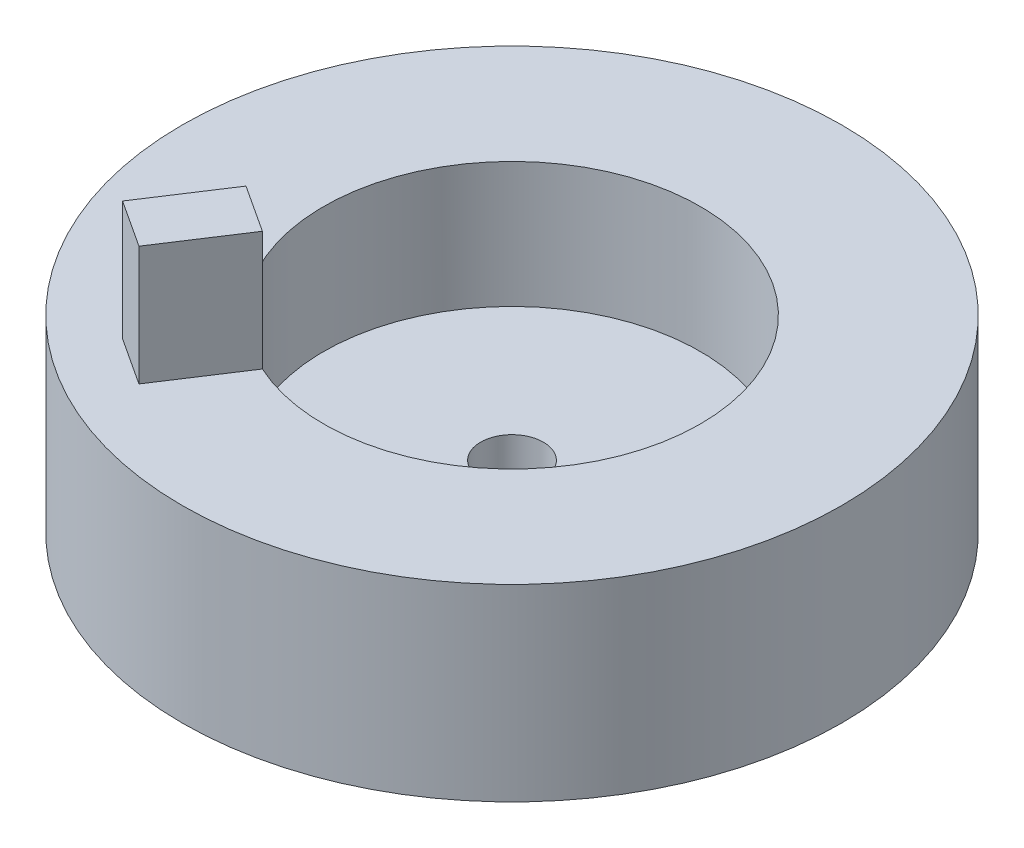
ISO-10303-21;
HEADER;
FILE_DESCRIPTION(('STEP AP214'),'2;1');
FILE_NAME('part.step','',(''),(''),'','','');
FILE_SCHEMA(('AUTOMOTIVE_DESIGN { 1 0 10303 214 1 1 1 1 }'));
ENDSEC;
DATA;
#1=APPLICATION_CONTEXT('core data for automotive mechanical design processes');
#2=APPLICATION_PROTOCOL_DEFINITION('international standard','automotive_design',2000,#1);
#3=PRODUCT_CONTEXT('',#1,'mechanical');
#4=PRODUCT('Part','Part','',(#3));
#5=PRODUCT_RELATED_PRODUCT_CATEGORY('part','',(#4));
#6=PRODUCT_DEFINITION_FORMATION('','',#4);
#7=PRODUCT_DEFINITION_CONTEXT('part definition',#1,'design');
#8=PRODUCT_DEFINITION('design','',#6,#7);
#9=PRODUCT_DEFINITION_SHAPE('','',#8);
#10=(LENGTH_UNIT() NAMED_UNIT(*) SI_UNIT(.MILLI.,.METRE.));
#11=(NAMED_UNIT(*) PLANE_ANGLE_UNIT() SI_UNIT($,.RADIAN.));
#12=(NAMED_UNIT(*) SI_UNIT($,.STERADIAN.) SOLID_ANGLE_UNIT());
#13=UNCERTAINTY_MEASURE_WITH_UNIT(LENGTH_MEASURE(1.E-05),#10,'distance_accuracy_value','');
#14=(GEOMETRIC_REPRESENTATION_CONTEXT(3) GLOBAL_UNCERTAINTY_ASSIGNED_CONTEXT((#13)) GLOBAL_UNIT_ASSIGNED_CONTEXT((#10,
#11,#12)) REPRESENTATION_CONTEXT('',''));
#15=CARTESIAN_POINT('',(0.,0.,0.));
#16=DIRECTION('',(0.,0.,1.));
#17=DIRECTION('',(1.,0.,0.));
#18=AXIS2_PLACEMENT_3D('',#15,#16,#17);
#19=CARTESIAN_POINT('',(0.,20.,0.));
#20=DIRECTION('',(0.,1.,0.));
#21=DIRECTION('',(0.,0.,1.));
#22=AXIS2_PLACEMENT_3D('',#19,#20,#21);
#23=PLANE('',#22);
#24=DIRECTION('',(-0.546944138603988,0.,0.837169104331222));
#25=VECTOR('',#24,1.);
#26=CARTESIAN_POINT('',(-19.9899412933513,20.,22.3696724850493));
#27=LINE('',#26,#25);
#28=CARTESIAN_POINT('',(-19.9899412933513,20.,22.3696724850492));
#29=VERTEX_POINT('',#28);
#30=CARTESIAN_POINT('',(-27.7565480615279,20.,34.2574737665526));
#31=VERTEX_POINT('',#30);
#32=EDGE_CURVE('E105',#29,#31,#27,.T.);
#33=ORIENTED_EDGE('',*,*,#32,.F.);
#34=CARTESIAN_POINT('',(0.,20.,0.));
#35=DIRECTION('',(0.,1.,0.));
#36=DIRECTION('',(0.,0.,1.));
#37=AXIS2_PLACEMENT_3D('',#34,#35,#36);
#38=CIRCLE('',#37,30.);
#39=CARTESIAN_POINT('',(-12.4554193543703,20.,27.2921697324851));
#40=VERTEX_POINT('',#39);
#41=EDGE_CURVE('E61',#40,#29,#38,.T.);
#42=ORIENTED_EDGE('',*,*,#41,.F.);
#43=DIRECTION('',(0.546944138603988,0.,-0.837169104331222));
#44=VECTOR('',#43,1.);
#45=CARTESIAN_POINT('',(-12.4554193543703,20.,27.2921697324851));
#46=LINE('',#45,#44);
#47=CARTESIAN_POINT('',(-20.2220261225469,20.,39.1799710139885));
#48=VERTEX_POINT('',#47);
#49=EDGE_CURVE('E145',#48,#40,#46,.T.);
#50=ORIENTED_EDGE('',*,*,#49,.F.);
#51=DIRECTION('',(0.837169104331223,0.,0.546944138603987));
#52=VECTOR('',#51,1.);
#53=CARTESIAN_POINT('',(-27.7565480615279,20.,34.2574737665526));
#54=LINE('',#53,#52);
#55=EDGE_CURVE('E56',#31,#48,#54,.T.);
#56=ORIENTED_EDGE('',*,*,#55,.F.);
#57=EDGE_LOOP('',(#33,#42,#50,#56));
#58=FACE_BOUND('',#57,.T.);
#59=CARTESIAN_POINT('',(0.,20.,0.));
#60=DIRECTION('',(0.,1.,0.));
#61=DIRECTION('',(0.,0.,1.));
#62=AXIS2_PLACEMENT_3D('',#59,#60,#61);
#63=CIRCLE('',#62,52.5);
#64=CARTESIAN_POINT('',(0.,20.,52.5));
#65=VERTEX_POINT('',#64);
#66=EDGE_CURVE('E11',#65,#65,#63,.T.);
#67=ORIENTED_EDGE('',*,*,#66,.T.);
#68=EDGE_LOOP('',(#67));
#69=FACE_BOUND('',#68,.T.);
#70=ADVANCED_FACE('F40',(#58,#69),#23,.T.);
#71=CARTESIAN_POINT('',(0.,20.,0.));
#72=DIRECTION('',(0.,-1.,0.));
#73=DIRECTION('',(0.,0.,-1.));
#74=AXIS2_PLACEMENT_3D('',#71,#72,#73);
#75=CYLINDRICAL_SURFACE('',#74,52.5);
#76=ORIENTED_EDGE('',*,*,#66,.F.);
#77=EDGE_LOOP('',(#76));
#78=FACE_BOUND('',#77,.T.);
#79=CARTESIAN_POINT('',(0.,-10.,0.));
#80=DIRECTION('',(0.,-1.,0.));
#81=DIRECTION('',(0.,0.,-1.));
#82=AXIS2_PLACEMENT_3D('',#79,#80,#81);
#83=CIRCLE('',#82,52.5);
#84=CARTESIAN_POINT('',(0.,-10.,-52.5));
#85=VERTEX_POINT('',#84);
#86=EDGE_CURVE('E117',#85,#85,#83,.T.);
#87=ORIENTED_EDGE('',*,*,#86,.F.);
#88=EDGE_LOOP('',(#87));
#89=FACE_BOUND('',#88,.T.);
#90=ADVANCED_FACE('F42',(#78,#89),#75,.T.);
#91=CARTESIAN_POINT('',(0.,20.,0.));
#92=DIRECTION('',(0.,-1.,0.));
#93=DIRECTION('',(0.,0.,-1.));
#94=AXIS2_PLACEMENT_3D('',#91,#92,#93);
#95=CYLINDRICAL_SURFACE('',#94,30.);
#96=EDGE_CURVE('E49',#29,#40,#38,.T.);
#97=ORIENTED_EDGE('',*,*,#96,.T.);
#98=ORIENTED_EDGE('',*,*,#41,.T.);
#99=EDGE_LOOP('',(#97,#98));
#100=FACE_BOUND('',#99,.T.);
#101=CARTESIAN_POINT('',(0.,0.,0.));
#102=DIRECTION('',(0.,1.,0.));
#103=DIRECTION('',(0.,0.,1.));
#104=AXIS2_PLACEMENT_3D('',#101,#102,#103);
#105=CIRCLE('',#104,30.);
#106=CARTESIAN_POINT('',(0.,0.,30.));
#107=VERTEX_POINT('',#106);
#108=EDGE_CURVE('E121',#107,#107,#105,.T.);
#109=ORIENTED_EDGE('',*,*,#108,.F.);
#110=EDGE_LOOP('',(#109));
#111=FACE_BOUND('',#110,.T.);
#112=ADVANCED_FACE('F132',(#100,#111),#95,.F.);
#113=CARTESIAN_POINT('',(0.,0.,0.));
#114=DIRECTION('',(0.,-1.,0.));
#115=DIRECTION('',(0.,0.,-1.));
#116=AXIS2_PLACEMENT_3D('',#113,#114,#115);
#117=PLANE('',#116);
#118=CARTESIAN_POINT('',(0.,0.,0.));
#119=DIRECTION('',(0.,-1.,0.));
#120=DIRECTION('',(0.,0.,-1.));
#121=AXIS2_PLACEMENT_3D('',#118,#119,#120);
#122=CIRCLE('',#121,5.);
#123=CARTESIAN_POINT('',(0.,0.,-5.));
#124=VERTEX_POINT('',#123);
#125=EDGE_CURVE('E106',#124,#124,#122,.T.);
#126=ORIENTED_EDGE('',*,*,#125,.T.);
#127=EDGE_LOOP('',(#126));
#128=FACE_BOUND('',#127,.T.);
#129=ORIENTED_EDGE('',*,*,#108,.T.);
#130=EDGE_LOOP('',(#129));
#131=FACE_BOUND('',#130,.T.);
#132=ADVANCED_FACE('F169',(#128,#131),#117,.F.);
#133=CARTESIAN_POINT('',(0.,-10.,0.));
#134=DIRECTION('',(0.,-1.,0.));
#135=DIRECTION('',(0.,0.,-1.));
#136=AXIS2_PLACEMENT_3D('',#133,#134,#135);
#137=PLANE('',#136);
#138=ORIENTED_EDGE('',*,*,#86,.T.);
#139=EDGE_LOOP('',(#138));
#140=FACE_BOUND('',#139,.T.);
#141=CARTESIAN_POINT('',(0.,-10.,0.));
#142=DIRECTION('',(0.,-1.,0.));
#143=DIRECTION('',(0.,0.,-1.));
#144=AXIS2_PLACEMENT_3D('',#141,#142,#143);
#145=CIRCLE('',#144,5.);
#146=CARTESIAN_POINT('',(0.,-10.,-5.));
#147=VERTEX_POINT('',#146);
#148=EDGE_CURVE('E110',#147,#147,#145,.T.);
#149=ORIENTED_EDGE('',*,*,#148,.F.);
#150=EDGE_LOOP('',(#149));
#151=FACE_BOUND('',#150,.T.);
#152=ADVANCED_FACE('F165',(#140,#151),#137,.T.);
#153=CARTESIAN_POINT('',(0.,-10.,0.));
#154=DIRECTION('',(0.,1.,0.));
#155=DIRECTION('',(0.,0.,1.));
#156=AXIS2_PLACEMENT_3D('',#153,#154,#155);
#157=CYLINDRICAL_SURFACE('',#156,5.);
#158=ORIENTED_EDGE('',*,*,#148,.T.);
#159=EDGE_LOOP('',(#158));
#160=FACE_BOUND('',#159,.T.);
#161=ORIENTED_EDGE('',*,*,#125,.F.);
#162=EDGE_LOOP('',(#161));
#163=FACE_BOUND('',#162,.T.);
#164=ADVANCED_FACE('F168',(#160,#163),#157,.F.);
#165=CARTESIAN_POINT('',(-19.9899412933513,39.,22.3696724850493));
#166=DIRECTION('',(0.837169104331222,0.,0.546944138603988));
#167=DIRECTION('',(0.546944138603988,0.,-0.837169104331222));
#168=AXIS2_PLACEMENT_3D('',#165,#166,#167);
#169=PLANE('',#168);
#170=ORIENTED_EDGE('',*,*,#32,.T.);
#171=DIRECTION('',(0.,-1.,0.));
#172=VECTOR('',#171,1.);
#173=CARTESIAN_POINT('',(-27.7565480615279,39.,34.2574737665526));
#174=LINE('',#173,#172);
#175=CARTESIAN_POINT('',(-27.7565480615279,39.,34.2574737665526));
#176=VERTEX_POINT('',#175);
#177=EDGE_CURVE('E84',#176,#31,#174,.T.);
#178=ORIENTED_EDGE('',*,*,#177,.F.);
#179=DIRECTION('',(-0.546944138603988,0.,0.837169104331222));
#180=VECTOR('',#179,1.);
#181=CARTESIAN_POINT('',(-19.9899412933513,39.,22.3696724850493));
#182=LINE('',#181,#180);
#183=CARTESIAN_POINT('',(-19.9899412933513,39.,22.3696724850493));
#184=VERTEX_POINT('',#183);
#185=EDGE_CURVE('E92',#184,#176,#182,.T.);
#186=ORIENTED_EDGE('',*,*,#185,.F.);
#187=DIRECTION('',(0.,-1.,0.));
#188=VECTOR('',#187,1.);
#189=CARTESIAN_POINT('',(-19.9899412933513,39.,22.3696724850493));
#190=LINE('',#189,#188);
#191=EDGE_CURVE('E142',#184,#29,#190,.T.);
#192=ORIENTED_EDGE('',*,*,#191,.T.);
#193=EDGE_LOOP('',(#170,#178,#186,#192));
#194=FACE_BOUND('',#193,.T.);
#195=ADVANCED_FACE('F104',(#194),#169,.F.);
#196=CARTESIAN_POINT('',(-27.7565480615279,39.,34.2574737665526));
#197=DIRECTION('',(0.546944138603987,0.,-0.837169104331223));
#198=DIRECTION('',(-0.837169104331223,0.,-0.546944138603987));
#199=AXIS2_PLACEMENT_3D('',#196,#197,#198);
#200=PLANE('',#199);
#201=ORIENTED_EDGE('',*,*,#55,.T.);
#202=DIRECTION('',(0.,-1.,0.));
#203=VECTOR('',#202,1.);
#204=CARTESIAN_POINT('',(-20.2220261225469,39.,39.1799710139885));
#205=LINE('',#204,#203);
#206=CARTESIAN_POINT('',(-20.2220261225469,39.,39.1799710139885));
#207=VERTEX_POINT('',#206);
#208=EDGE_CURVE('E87',#207,#48,#205,.T.);
#209=ORIENTED_EDGE('',*,*,#208,.F.);
#210=DIRECTION('',(0.837169104331223,0.,0.546944138603987));
#211=VECTOR('',#210,1.);
#212=CARTESIAN_POINT('',(-27.7565480615279,39.,34.2574737665526));
#213=LINE('',#212,#211);
#214=EDGE_CURVE('E80',#176,#207,#213,.T.);
#215=ORIENTED_EDGE('',*,*,#214,.F.);
#216=ORIENTED_EDGE('',*,*,#177,.T.);
#217=EDGE_LOOP('',(#201,#209,#215,#216));
#218=FACE_BOUND('',#217,.T.);
#219=ADVANCED_FACE('F82',(#218),#200,.F.);
#220=CARTESIAN_POINT('',(-12.4554193543703,39.,27.2921697324851));
#221=DIRECTION('',(-0.837169104331222,0.,-0.546944138603989));
#222=DIRECTION('',(-0.546944138603989,0.,0.837169104331222));
#223=AXIS2_PLACEMENT_3D('',#220,#221,#222);
#224=PLANE('',#223);
#225=ORIENTED_EDGE('',*,*,#49,.T.);
#226=DIRECTION('',(0.,-1.,0.));
#227=VECTOR('',#226,1.);
#228=CARTESIAN_POINT('',(-12.4554193543703,39.,27.2921697324851));
#229=LINE('',#228,#227);
#230=CARTESIAN_POINT('',(-12.4554193543703,39.,27.2921697324851));
#231=VERTEX_POINT('',#230);
#232=EDGE_CURVE('E112',#231,#40,#229,.T.);
#233=ORIENTED_EDGE('',*,*,#232,.F.);
#234=DIRECTION('',(0.546944138603988,0.,-0.837169104331222));
#235=VECTOR('',#234,1.);
#236=CARTESIAN_POINT('',(-12.4554193543703,39.,27.2921697324851));
#237=LINE('',#236,#235);
#238=EDGE_CURVE('E91',#207,#231,#237,.T.);
#239=ORIENTED_EDGE('',*,*,#238,.F.);
#240=ORIENTED_EDGE('',*,*,#208,.T.);
#241=EDGE_LOOP('',(#225,#233,#239,#240));
#242=FACE_BOUND('',#241,.T.);
#243=ADVANCED_FACE('F156',(#242),#224,.F.);
#244=CARTESIAN_POINT('',(-12.4554193543703,39.,27.2921697324851));
#245=DIRECTION('',(-0.546944138603987,0.,0.837169104331223));
#246=DIRECTION('',(0.837169104331223,0.,0.546944138603987));
#247=AXIS2_PLACEMENT_3D('',#244,#245,#246);
#248=PLANE('',#247);
#249=DIRECTION('',(-0.837169104331223,0.,-0.546944138603987));
#250=VECTOR('',#249,1.);
#251=CARTESIAN_POINT('',(-12.4554193543703,20.,27.2921697324851));
#252=LINE('',#251,#250);
#253=EDGE_CURVE('E102',#40,#29,#252,.T.);
#254=ORIENTED_EDGE('',*,*,#253,.T.);
#255=ORIENTED_EDGE('',*,*,#191,.F.);
#256=DIRECTION('',(-0.837169104331223,0.,-0.546944138603987));
#257=VECTOR('',#256,1.);
#258=CARTESIAN_POINT('',(-12.4554193543703,39.,27.2921697324851));
#259=LINE('',#258,#257);
#260=EDGE_CURVE('E97',#231,#184,#259,.T.);
#261=ORIENTED_EDGE('',*,*,#260,.F.);
#262=ORIENTED_EDGE('',*,*,#232,.T.);
#263=EDGE_LOOP('',(#254,#255,#261,#262));
#264=FACE_BOUND('',#263,.T.);
#265=ADVANCED_FACE('F141',(#264),#248,.F.);
#266=CARTESIAN_POINT('',(0.,39.,0.));
#267=DIRECTION('',(0.,1.,0.));
#268=DIRECTION('',(0.,0.,1.));
#269=AXIS2_PLACEMENT_3D('',#266,#267,#268);
#270=PLANE('',#269);
#271=ORIENTED_EDGE('',*,*,#185,.T.);
#272=ORIENTED_EDGE('',*,*,#214,.T.);
#273=ORIENTED_EDGE('',*,*,#238,.T.);
#274=ORIENTED_EDGE('',*,*,#260,.T.);
#275=EDGE_LOOP('',(#271,#272,#273,#274));
#276=FACE_BOUND('',#275,.T.);
#277=ADVANCED_FACE('F95',(#276),#270,.T.);
#278=CARTESIAN_POINT('',(0.,20.,0.));
#279=DIRECTION('',(0.,1.,0.));
#280=DIRECTION('',(0.,0.,1.));
#281=AXIS2_PLACEMENT_3D('',#278,#279,#280);
#282=PLANE('',#281);
#283=ORIENTED_EDGE('',*,*,#96,.F.);
#284=ORIENTED_EDGE('',*,*,#253,.F.);
#285=EDGE_LOOP('',(#283,#284));
#286=FACE_BOUND('',#285,.T.);
#287=ADVANCED_FACE('F138',(#286),#282,.F.);
#288=CLOSED_SHELL('',(#70,#90,#112,#132,#152,#164,#195,#219,#243,#265,#277,#287));
#289=MANIFOLD_SOLID_BREP('B2',#288);
#290=ADVANCED_BREP_SHAPE_REPRESENTATION('',(#18,#289),#14);
#291=SHAPE_DEFINITION_REPRESENTATION(#9,#290);
ENDSEC;
END-ISO-10303-21;
